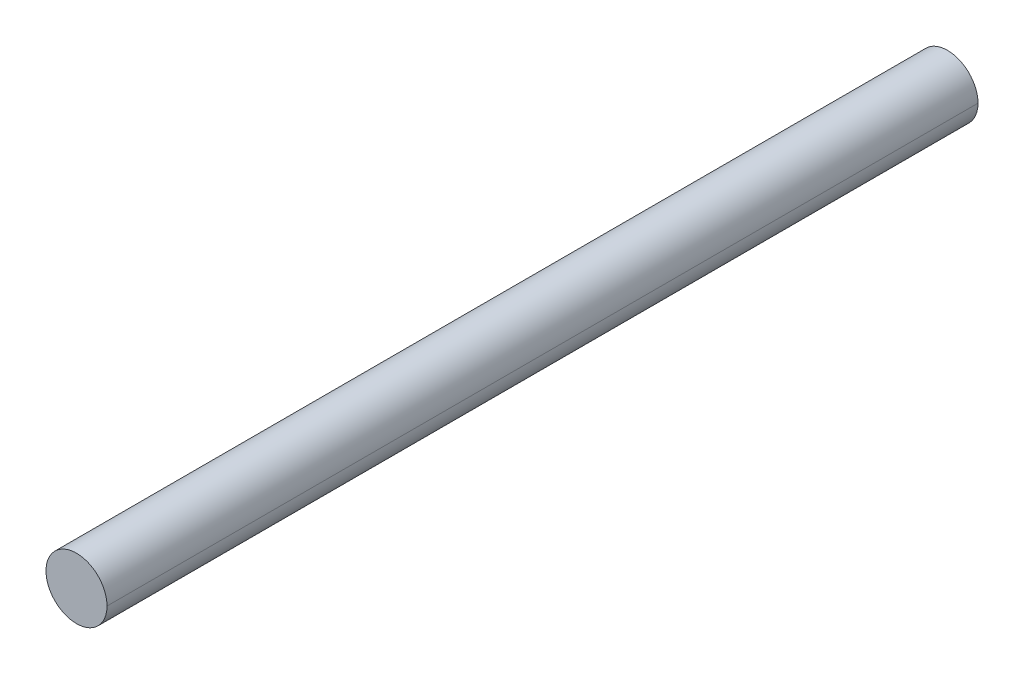
ISO-10303-21;
HEADER;
FILE_DESCRIPTION(('STEP AP214'),'2;1');
FILE_NAME('part.step','',(''),(''),'','','');
FILE_SCHEMA(('AUTOMOTIVE_DESIGN { 1 0 10303 214 1 1 1 1 }'));
ENDSEC;
DATA;
#1=APPLICATION_CONTEXT('core data for automotive mechanical design processes');
#2=APPLICATION_PROTOCOL_DEFINITION('international standard','automotive_design',2000,#1);
#3=PRODUCT_CONTEXT('',#1,'mechanical');
#4=PRODUCT('Part','Part','',(#3));
#5=PRODUCT_RELATED_PRODUCT_CATEGORY('part','',(#4));
#6=PRODUCT_DEFINITION_FORMATION('','',#4);
#7=PRODUCT_DEFINITION_CONTEXT('part definition',#1,'design');
#8=PRODUCT_DEFINITION('design','',#6,#7);
#9=PRODUCT_DEFINITION_SHAPE('','',#8);
#10=(LENGTH_UNIT() NAMED_UNIT(*) SI_UNIT(.MILLI.,.METRE.));
#11=(NAMED_UNIT(*) PLANE_ANGLE_UNIT() SI_UNIT($,.RADIAN.));
#12=(NAMED_UNIT(*) SI_UNIT($,.STERADIAN.) SOLID_ANGLE_UNIT());
#13=UNCERTAINTY_MEASURE_WITH_UNIT(LENGTH_MEASURE(1.E-05),#10,'distance_accuracy_value','');
#14=(GEOMETRIC_REPRESENTATION_CONTEXT(3) GLOBAL_UNCERTAINTY_ASSIGNED_CONTEXT((#13)) GLOBAL_UNIT_ASSIGNED_CONTEXT((#10,
#11,#12)) REPRESENTATION_CONTEXT('',''));
#15=CARTESIAN_POINT('',(0.,0.,0.));
#16=DIRECTION('',(0.,0.,1.));
#17=DIRECTION('',(1.,0.,0.));
#18=AXIS2_PLACEMENT_3D('',#15,#16,#17);
#19=CARTESIAN_POINT('',(50.9750125,1.52500076,2.));
#20=DIRECTION('',(0.,0.,1.));
#21=DIRECTION('',(1.,0.,0.));
#22=AXIS2_PLACEMENT_3D('',#19,#20,#21);
#23=CYLINDRICAL_SURFACE('',#22,0.2452455);
#24=CARTESIAN_POINT('',(51.156832650377,1.360420116584,-1.5));
#25=CARTESIAN_POINT('',(51.156832650377,1.360420116584,5.5));
#26=(BOUNDED_CURVE() B_SPLINE_CURVE(1,(#24,#25),.UNSPECIFIED.,.F.,
.F.) B_SPLINE_CURVE_WITH_KNOTS((2,2),(0.,7.),
.UNSPECIFIED.) CURVE() GEOMETRIC_REPRESENTATION_ITEM() RATIONAL_B_SPLINE_CURVE((1.,1.)) REPRESENTATION_ITEM(''));
#27=CARTESIAN_POINT('',(51.156832650377,1.360420116584,-1.5));
#28=VERTEX_POINT('',#27);
#29=CARTESIAN_POINT('',(51.156832650377,1.360420116584,5.5));
#30=VERTEX_POINT('',#29);
#31=EDGE_CURVE('E70',#28,#30,#26,.T.);
#32=ORIENTED_EDGE('',*,*,#31,.T.);
#33=CARTESIAN_POINT('',(50.793192349623,1.689581403416,5.5));
#34=CARTESIAN_POINT('',(50.628611706207,1.50776125304,5.5));
#35=CARTESIAN_POINT('',(50.810431856584,1.343180609623,5.5));
#36=CARTESIAN_POINT('',(50.99225200696,1.178599966207,5.5));
#37=CARTESIAN_POINT('',(51.156832650377,1.360420116584,5.5));
#38=(BOUNDED_CURVE() B_SPLINE_CURVE(2,(#33,#34,#35,#36,#37),.UNSPECIFIED.,.F.,
.F.) B_SPLINE_CURVE_WITH_KNOTS((3,2,3),(-2.986055542903,-2.239541657177,-1.493027771452),
.UNSPECIFIED.) CURVE() GEOMETRIC_REPRESENTATION_ITEM() RATIONAL_B_SPLINE_CURVE((1.,
0.707106781187,1.,0.707106781187,1.)) REPRESENTATION_ITEM(''));
#39=CARTESIAN_POINT('',(50.793192349623,1.689581403416,5.5));
#40=VERTEX_POINT('',#39);
#41=EDGE_CURVE('E27',#40,#30,#38,.T.);
#42=ORIENTED_EDGE('',*,*,#41,.F.);
#43=CARTESIAN_POINT('',(50.793192349623,1.689581403416,-1.5));
#44=CARTESIAN_POINT('',(50.793192349623,1.689581403416,5.5));
#45=(BOUNDED_CURVE() B_SPLINE_CURVE(1,(#43,#44),.UNSPECIFIED.,.F.,
.F.) B_SPLINE_CURVE_WITH_KNOTS((2,2),(0.,7.),
.UNSPECIFIED.) CURVE() GEOMETRIC_REPRESENTATION_ITEM() RATIONAL_B_SPLINE_CURVE((1.,1.)) REPRESENTATION_ITEM(''));
#46=CARTESIAN_POINT('',(50.793192349623,1.689581403416,-1.5));
#47=VERTEX_POINT('',#46);
#48=EDGE_CURVE('E69',#47,#40,#45,.T.);
#49=ORIENTED_EDGE('',*,*,#48,.F.);
#50=CARTESIAN_POINT('',(50.793192349623,1.689581403416,-1.5));
#51=CARTESIAN_POINT('',(50.628611706207,1.50776125304,-1.5));
#52=CARTESIAN_POINT('',(50.810431856584,1.343180609623,-1.5));
#53=CARTESIAN_POINT('',(50.99225200696,1.178599966207,-1.5));
#54=CARTESIAN_POINT('',(51.156832650377,1.360420116584,-1.5));
#55=(BOUNDED_CURVE() B_SPLINE_CURVE(2,(#50,#51,#52,#53,#54),.UNSPECIFIED.,.F.,
.F.) B_SPLINE_CURVE_WITH_KNOTS((3,2,3),(-2.986055542903,-2.239541657177,-1.493027771452),
.UNSPECIFIED.) CURVE() GEOMETRIC_REPRESENTATION_ITEM() RATIONAL_B_SPLINE_CURVE((1.,
0.707106781187,1.,0.707106781187,1.)) REPRESENTATION_ITEM(''));
#56=EDGE_CURVE('E11',#47,#28,#55,.T.);
#57=ORIENTED_EDGE('',*,*,#56,.T.);
#58=EDGE_LOOP('',(#32,#42,#49,#57));
#59=FACE_BOUND('',#58,.T.);
#60=ADVANCED_FACE('F17',(#59),#23,.T.);
#61=CARTESIAN_POINT('',(51.281569375,1.831557635,-1.5));
#62=DIRECTION('',(0.,0.,-1.));
#63=DIRECTION('',(0.,-1.,0.));
#64=AXIS2_PLACEMENT_3D('',#61,#62,#63);
#65=PLANE('',#64);
#66=CARTESIAN_POINT('',(51.156832650377,1.360420116584,-1.5));
#67=CARTESIAN_POINT('',(51.220258,1.430489150018,-1.5));
#68=CARTESIAN_POINT('',(51.220258,1.52500076,-1.5));
#69=(BOUNDED_CURVE() B_SPLINE_CURVE(2,(#66,#67,#68),.UNSPECIFIED.,.F.,
.F.) B_SPLINE_CURVE_WITH_KNOTS((3,3),(-1.493027771452,-1.142180262226),
.UNSPECIFIED.) CURVE() GEOMETRIC_REPRESENTATION_ITEM() RATIONAL_B_SPLINE_CURVE((1.,
0.862345686725,0.854081258542)) REPRESENTATION_ITEM(''));
#70=CARTESIAN_POINT('',(51.220258,1.52500076,-1.5));
#71=VERTEX_POINT('',#70);
#72=EDGE_CURVE('E65',#28,#71,#69,.T.);
#73=ORIENTED_EDGE('',*,*,#72,.F.);
#74=ORIENTED_EDGE('',*,*,#56,.F.);
#75=CARTESIAN_POINT('',(51.220258,1.52500076,-1.5));
#76=CARTESIAN_POINT('',(51.220258,1.633804393945,-1.5));
#77=CARTESIAN_POINT('',(51.139593143416,1.706820910377,-1.5));
#78=CARTESIAN_POINT('',(50.95777299304,1.871401553793,-1.5));
#79=CARTESIAN_POINT('',(50.793192349623,1.689581403416,-1.5));
#80=(BOUNDED_CURVE() B_SPLINE_CURVE(2,(#75,#76,#77,#78,#79),.UNSPECIFIED.,.F.,
.F.) B_SPLINE_CURVE_WITH_KNOTS((3,2,3),(-1.142180262226,-0.746513885726,0.),
.UNSPECIFIED.) CURVE() GEOMETRIC_REPRESENTATION_ITEM() RATIONAL_B_SPLINE_CURVE((0.854081258542,
0.844761094461,1.,0.707106781187,1.)) REPRESENTATION_ITEM(''));
#81=EDGE_CURVE('E61',#71,#47,#80,.T.);
#82=ORIENTED_EDGE('',*,*,#81,.F.);
#83=EDGE_LOOP('',(#73,#74,#82));
#84=FACE_BOUND('',#83,.T.);
#85=ADVANCED_FACE('F63',(#84),#65,.T.);
#86=CARTESIAN_POINT('',(51.281569375,1.831557635,5.5));
#87=DIRECTION('',(0.,0.,1.));
#88=DIRECTION('',(1.,0.,0.));
#89=AXIS2_PLACEMENT_3D('',#86,#87,#88);
#90=PLANE('',#89);
#91=ORIENTED_EDGE('',*,*,#41,.T.);
#92=CARTESIAN_POINT('',(51.156832650377,1.360420116584,5.5));
#93=CARTESIAN_POINT('',(51.220258,1.430489150018,5.5));
#94=CARTESIAN_POINT('',(51.220258,1.52500076,5.5));
#95=(BOUNDED_CURVE() B_SPLINE_CURVE(2,(#92,#93,#94),.UNSPECIFIED.,.F.,
.F.) B_SPLINE_CURVE_WITH_KNOTS((3,3),(-1.493027771452,-1.142180262226),
.UNSPECIFIED.) CURVE() GEOMETRIC_REPRESENTATION_ITEM() RATIONAL_B_SPLINE_CURVE((1.,
0.862345686725,0.854081258542)) REPRESENTATION_ITEM(''));
#96=CARTESIAN_POINT('',(51.220258,1.52500076,5.5));
#97=VERTEX_POINT('',#96);
#98=EDGE_CURVE('E80',#30,#97,#95,.T.);
#99=ORIENTED_EDGE('',*,*,#98,.T.);
#100=CARTESIAN_POINT('',(51.220258,1.52500076,5.5));
#101=CARTESIAN_POINT('',(51.220258,1.633804393945,5.5));
#102=CARTESIAN_POINT('',(51.139593143416,1.706820910377,5.5));
#103=CARTESIAN_POINT('',(50.95777299304,1.871401553793,5.5));
#104=CARTESIAN_POINT('',(50.793192349623,1.689581403416,5.5));
#105=(BOUNDED_CURVE() B_SPLINE_CURVE(2,(#100,#101,#102,#103,#104),.UNSPECIFIED.,.F.,
.F.) B_SPLINE_CURVE_WITH_KNOTS((3,2,3),(-1.142180262226,-0.746513885726,0.),
.UNSPECIFIED.) CURVE() GEOMETRIC_REPRESENTATION_ITEM() RATIONAL_B_SPLINE_CURVE((0.854081258542,
0.844761094461,1.,0.707106781187,1.)) REPRESENTATION_ITEM(''));
#106=EDGE_CURVE('E75',#97,#40,#105,.T.);
#107=ORIENTED_EDGE('',*,*,#106,.T.);
#108=EDGE_LOOP('',(#91,#99,#107));
#109=FACE_BOUND('',#108,.T.);
#110=ADVANCED_FACE('F136',(#109),#90,.T.);
#111=CARTESIAN_POINT('',(50.9750125,1.52500076,2.));
#112=DIRECTION('',(0.,0.,1.));
#113=DIRECTION('',(1.,0.,0.));
#114=AXIS2_PLACEMENT_3D('',#111,#112,#113);
#115=CYLINDRICAL_SURFACE('',#114,0.2452455);
#116=DIRECTION('',(0.,0.,1.));
#117=VECTOR('',#116,1.);
#118=CARTESIAN_POINT('',(51.220258,1.52500076,2.));
#119=LINE('',#118,#117);
#120=EDGE_CURVE('E73',#71,#97,#119,.T.);
#121=ORIENTED_EDGE('',*,*,#120,.F.);
#122=ORIENTED_EDGE('',*,*,#81,.T.);
#123=ORIENTED_EDGE('',*,*,#48,.T.);
#124=ORIENTED_EDGE('',*,*,#106,.F.);
#125=EDGE_LOOP('',(#121,#122,#123,#124));
#126=FACE_BOUND('',#125,.T.);
#127=ADVANCED_FACE('F74',(#126),#115,.T.);
#128=CARTESIAN_POINT('',(50.9750125,1.52500076,2.));
#129=DIRECTION('',(0.,0.,1.));
#130=DIRECTION('',(1.,0.,0.));
#131=AXIS2_PLACEMENT_3D('',#128,#129,#130);
#132=CYLINDRICAL_SURFACE('',#131,0.2452455);
#133=ORIENTED_EDGE('',*,*,#72,.T.);
#134=ORIENTED_EDGE('',*,*,#120,.T.);
#135=ORIENTED_EDGE('',*,*,#98,.F.);
#136=ORIENTED_EDGE('',*,*,#31,.F.);
#137=EDGE_LOOP('',(#133,#134,#135,#136));
#138=FACE_BOUND('',#137,.T.);
#139=ADVANCED_FACE('F83',(#138),#132,.T.);
#140=CLOSED_SHELL('',(#60,#85,#110,#127,#139));
#141=MANIFOLD_SOLID_BREP('B1',#140);
#142=ADVANCED_BREP_SHAPE_REPRESENTATION('',(#18,#141),#14);
#143=SHAPE_DEFINITION_REPRESENTATION(#9,#142);
ENDSEC;
END-ISO-10303-21;
